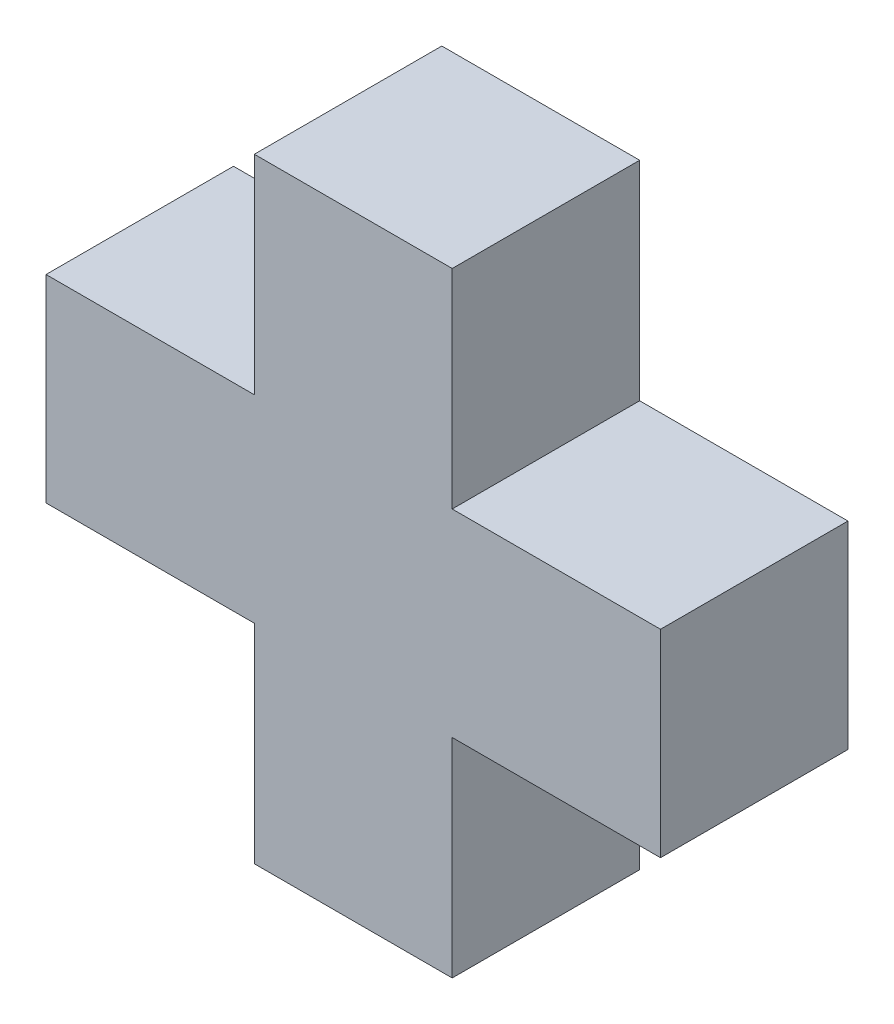
ISO-10303-21;
HEADER;
FILE_DESCRIPTION(('STEP AP214'),'2;1');
FILE_NAME('part.step','',(''),(''),'','','');
FILE_SCHEMA(('AUTOMOTIVE_DESIGN { 1 0 10303 214 1 1 1 1 }'));
ENDSEC;
DATA;
#1=APPLICATION_CONTEXT('core data for automotive mechanical design processes');
#2=APPLICATION_PROTOCOL_DEFINITION('international standard','automotive_design',2000,#1);
#3=PRODUCT_CONTEXT('',#1,'mechanical');
#4=PRODUCT('Part','Part','',(#3));
#5=PRODUCT_RELATED_PRODUCT_CATEGORY('part','',(#4));
#6=PRODUCT_DEFINITION_FORMATION('','',#4);
#7=PRODUCT_DEFINITION_CONTEXT('part definition',#1,'design');
#8=PRODUCT_DEFINITION('design','',#6,#7);
#9=PRODUCT_DEFINITION_SHAPE('','',#8);
#10=(LENGTH_UNIT() NAMED_UNIT(*) SI_UNIT(.MILLI.,.METRE.));
#11=(NAMED_UNIT(*) PLANE_ANGLE_UNIT() SI_UNIT($,.RADIAN.));
#12=(NAMED_UNIT(*) SI_UNIT($,.STERADIAN.) SOLID_ANGLE_UNIT());
#13=UNCERTAINTY_MEASURE_WITH_UNIT(LENGTH_MEASURE(1.E-05),#10,'distance_accuracy_value','');
#14=(GEOMETRIC_REPRESENTATION_CONTEXT(3) GLOBAL_UNCERTAINTY_ASSIGNED_CONTEXT((#13)) GLOBAL_UNIT_ASSIGNED_CONTEXT((#10,
#11,#12)) REPRESENTATION_CONTEXT('',''));
#15=CARTESIAN_POINT('',(0.,0.,0.));
#16=DIRECTION('',(0.,0.,1.));
#17=DIRECTION('',(1.,0.,0.));
#18=AXIS2_PLACEMENT_3D('',#15,#16,#17);
#19=CARTESIAN_POINT('',(4.75,4.75,9.));
#20=DIRECTION('',(-1.,0.,0.));
#21=DIRECTION('',(0.,-1.,0.));
#22=AXIS2_PLACEMENT_3D('',#19,#20,#21);
#23=PLANE('',#22);
#24=DIRECTION('',(0.,1.,0.));
#25=VECTOR('',#24,1.);
#26=CARTESIAN_POINT('',(4.75,4.75,0.));
#27=LINE('',#26,#25);
#28=CARTESIAN_POINT('',(4.75,4.75,0.));
#29=VERTEX_POINT('',#28);
#30=CARTESIAN_POINT('',(4.75,14.75,0.));
#31=VERTEX_POINT('',#30);
#32=EDGE_CURVE('E164',#29,#31,#27,.T.);
#33=ORIENTED_EDGE('',*,*,#32,.T.);
#34=DIRECTION('',(0.,0.,-1.));
#35=VECTOR('',#34,1.);
#36=CARTESIAN_POINT('',(4.75,14.75,9.));
#37=LINE('',#36,#35);
#38=CARTESIAN_POINT('',(4.75,14.75,9.));
#39=VERTEX_POINT('',#38);
#40=EDGE_CURVE('E11',#39,#31,#37,.T.);
#41=ORIENTED_EDGE('',*,*,#40,.F.);
#42=DIRECTION('',(0.,1.,0.));
#43=VECTOR('',#42,1.);
#44=CARTESIAN_POINT('',(4.75,4.75,9.));
#45=LINE('',#44,#43);
#46=CARTESIAN_POINT('',(4.75,4.75,9.));
#47=VERTEX_POINT('',#46);
#48=EDGE_CURVE('E198',#47,#39,#45,.T.);
#49=ORIENTED_EDGE('',*,*,#48,.F.);
#50=DIRECTION('',(0.,0.,-1.));
#51=VECTOR('',#50,1.);
#52=CARTESIAN_POINT('',(4.75,4.75,9.));
#53=LINE('',#52,#51);
#54=EDGE_CURVE('E160',#47,#29,#53,.T.);
#55=ORIENTED_EDGE('',*,*,#54,.T.);
#56=EDGE_LOOP('',(#33,#41,#49,#55));
#57=FACE_BOUND('',#56,.T.);
#58=ADVANCED_FACE('F39',(#57),#23,.F.);
#59=CARTESIAN_POINT('',(-4.75,14.75,9.));
#60=DIRECTION('',(0.,-1.,0.));
#61=DIRECTION('',(1.,0.,0.));
#62=AXIS2_PLACEMENT_3D('',#59,#60,#61);
#63=PLANE('',#62);
#64=DIRECTION('',(-1.,0.,0.));
#65=VECTOR('',#64,1.);
#66=CARTESIAN_POINT('',(-4.75,14.75,0.));
#67=LINE('',#66,#65);
#68=CARTESIAN_POINT('',(-4.75,14.75,0.));
#69=VERTEX_POINT('',#68);
#70=EDGE_CURVE('E168',#31,#69,#67,.T.);
#71=ORIENTED_EDGE('',*,*,#70,.T.);
#72=DIRECTION('',(0.,0.,-1.));
#73=VECTOR('',#72,1.);
#74=CARTESIAN_POINT('',(-4.75,14.75,9.));
#75=LINE('',#74,#73);
#76=CARTESIAN_POINT('',(-4.75,14.75,9.));
#77=VERTEX_POINT('',#76);
#78=EDGE_CURVE('E48',#77,#69,#75,.T.);
#79=ORIENTED_EDGE('',*,*,#78,.F.);
#80=DIRECTION('',(-1.,0.,0.));
#81=VECTOR('',#80,1.);
#82=CARTESIAN_POINT('',(-4.75,14.75,9.));
#83=LINE('',#82,#81);
#84=EDGE_CURVE('E111',#39,#77,#83,.T.);
#85=ORIENTED_EDGE('',*,*,#84,.F.);
#86=ORIENTED_EDGE('',*,*,#40,.T.);
#87=EDGE_LOOP('',(#71,#79,#85,#86));
#88=FACE_BOUND('',#87,.T.);
#89=ADVANCED_FACE('F292',(#88),#63,.F.);
#90=CARTESIAN_POINT('',(-4.75,4.75,9.));
#91=DIRECTION('',(1.,0.,0.));
#92=DIRECTION('',(0.,1.,0.));
#93=AXIS2_PLACEMENT_3D('',#90,#91,#92);
#94=PLANE('',#93);
#95=DIRECTION('',(0.,-1.,0.));
#96=VECTOR('',#95,1.);
#97=CARTESIAN_POINT('',(-4.75,4.75,0.));
#98=LINE('',#97,#96);
#99=CARTESIAN_POINT('',(-4.75,4.75,0.));
#100=VERTEX_POINT('',#99);
#101=EDGE_CURVE('E171',#69,#100,#98,.T.);
#102=ORIENTED_EDGE('',*,*,#101,.T.);
#103=DIRECTION('',(0.,0.,-1.));
#104=VECTOR('',#103,1.);
#105=CARTESIAN_POINT('',(-4.75,4.75,9.));
#106=LINE('',#105,#104);
#107=CARTESIAN_POINT('',(-4.75,4.75,9.));
#108=VERTEX_POINT('',#107);
#109=EDGE_CURVE('E225',#108,#100,#106,.T.);
#110=ORIENTED_EDGE('',*,*,#109,.F.);
#111=DIRECTION('',(0.,-1.,0.));
#112=VECTOR('',#111,1.);
#113=CARTESIAN_POINT('',(-4.75,4.75,9.));
#114=LINE('',#113,#112);
#115=EDGE_CURVE('E235',#77,#108,#114,.T.);
#116=ORIENTED_EDGE('',*,*,#115,.F.);
#117=ORIENTED_EDGE('',*,*,#78,.T.);
#118=EDGE_LOOP('',(#102,#110,#116,#117));
#119=FACE_BOUND('',#118,.T.);
#120=ADVANCED_FACE('F233',(#119),#94,.F.);
#121=CARTESIAN_POINT('',(-14.75,4.75,9.));
#122=DIRECTION('',(0.,-1.,0.));
#123=DIRECTION('',(1.,0.,0.));
#124=AXIS2_PLACEMENT_3D('',#121,#122,#123);
#125=PLANE('',#124);
#126=DIRECTION('',(-1.,0.,0.));
#127=VECTOR('',#126,1.);
#128=CARTESIAN_POINT('',(-14.75,4.75,0.));
#129=LINE('',#128,#127);
#130=CARTESIAN_POINT('',(-14.75,4.75,0.));
#131=VERTEX_POINT('',#130);
#132=EDGE_CURVE('E174',#100,#131,#129,.T.);
#133=ORIENTED_EDGE('',*,*,#132,.T.);
#134=DIRECTION('',(0.,0.,-1.));
#135=VECTOR('',#134,1.);
#136=CARTESIAN_POINT('',(-14.75,4.75,9.));
#137=LINE('',#136,#135);
#138=CARTESIAN_POINT('',(-14.75,4.75,9.));
#139=VERTEX_POINT('',#138);
#140=EDGE_CURVE('E221',#139,#131,#137,.T.);
#141=ORIENTED_EDGE('',*,*,#140,.F.);
#142=DIRECTION('',(-1.,0.,0.));
#143=VECTOR('',#142,1.);
#144=CARTESIAN_POINT('',(-14.75,4.75,9.));
#145=LINE('',#144,#143);
#146=EDGE_CURVE('E254',#108,#139,#145,.T.);
#147=ORIENTED_EDGE('',*,*,#146,.F.);
#148=ORIENTED_EDGE('',*,*,#109,.T.);
#149=EDGE_LOOP('',(#133,#141,#147,#148));
#150=FACE_BOUND('',#149,.T.);
#151=ADVANCED_FACE('F244',(#150),#125,.F.);
#152=CARTESIAN_POINT('',(-14.75,-4.75,9.));
#153=DIRECTION('',(1.,0.,0.));
#154=DIRECTION('',(0.,0.,-1.));
#155=AXIS2_PLACEMENT_3D('',#152,#153,#154);
#156=PLANE('',#155);
#157=DIRECTION('',(0.,-1.,0.));
#158=VECTOR('',#157,1.);
#159=CARTESIAN_POINT('',(-14.75,-4.75,0.));
#160=LINE('',#159,#158);
#161=CARTESIAN_POINT('',(-14.75,-4.75,0.));
#162=VERTEX_POINT('',#161);
#163=EDGE_CURVE('E177',#131,#162,#160,.T.);
#164=ORIENTED_EDGE('',*,*,#163,.T.);
#165=DIRECTION('',(0.,0.,-1.));
#166=VECTOR('',#165,1.);
#167=CARTESIAN_POINT('',(-14.75,-4.75,9.));
#168=LINE('',#167,#166);
#169=CARTESIAN_POINT('',(-14.75,-4.75,9.));
#170=VERTEX_POINT('',#169);
#171=EDGE_CURVE('E217',#170,#162,#168,.T.);
#172=ORIENTED_EDGE('',*,*,#171,.F.);
#173=DIRECTION('',(0.,-1.,0.));
#174=VECTOR('',#173,1.);
#175=CARTESIAN_POINT('',(-14.75,-4.75,9.));
#176=LINE('',#175,#174);
#177=EDGE_CURVE('E250',#139,#170,#176,.T.);
#178=ORIENTED_EDGE('',*,*,#177,.F.);
#179=ORIENTED_EDGE('',*,*,#140,.T.);
#180=EDGE_LOOP('',(#164,#172,#178,#179));
#181=FACE_BOUND('',#180,.T.);
#182=ADVANCED_FACE('F248',(#181),#156,.F.);
#183=CARTESIAN_POINT('',(-14.75,-4.75,9.));
#184=DIRECTION('',(0.,1.,0.));
#185=DIRECTION('',(-1.,0.,0.));
#186=AXIS2_PLACEMENT_3D('',#183,#184,#185);
#187=PLANE('',#186);
#188=DIRECTION('',(1.,0.,0.));
#189=VECTOR('',#188,1.);
#190=CARTESIAN_POINT('',(-14.75,-4.75,0.));
#191=LINE('',#190,#189);
#192=CARTESIAN_POINT('',(-4.75,-4.75,0.));
#193=VERTEX_POINT('',#192);
#194=EDGE_CURVE('E180',#162,#193,#191,.T.);
#195=ORIENTED_EDGE('',*,*,#194,.T.);
#196=DIRECTION('',(0.,0.,-1.));
#197=VECTOR('',#196,1.);
#198=CARTESIAN_POINT('',(-4.75,-4.75,9.));
#199=LINE('',#198,#197);
#200=CARTESIAN_POINT('',(-4.75,-4.75,9.));
#201=VERTEX_POINT('',#200);
#202=EDGE_CURVE('E213',#201,#193,#199,.T.);
#203=ORIENTED_EDGE('',*,*,#202,.F.);
#204=DIRECTION('',(1.,0.,0.));
#205=VECTOR('',#204,1.);
#206=CARTESIAN_POINT('',(-14.75,-4.75,9.));
#207=LINE('',#206,#205);
#208=EDGE_CURVE('E253',#170,#201,#207,.T.);
#209=ORIENTED_EDGE('',*,*,#208,.F.);
#210=ORIENTED_EDGE('',*,*,#171,.T.);
#211=EDGE_LOOP('',(#195,#203,#209,#210));
#212=FACE_BOUND('',#211,.T.);
#213=ADVANCED_FACE('F305',(#212),#187,.F.);
#214=CARTESIAN_POINT('',(-4.75,-14.75,9.));
#215=DIRECTION('',(1.,0.,0.));
#216=DIRECTION('',(0.,1.,0.));
#217=AXIS2_PLACEMENT_3D('',#214,#215,#216);
#218=PLANE('',#217);
#219=DIRECTION('',(0.,-1.,0.));
#220=VECTOR('',#219,1.);
#221=CARTESIAN_POINT('',(-4.75,-14.75,0.));
#222=LINE('',#221,#220);
#223=CARTESIAN_POINT('',(-4.75,-14.75,0.));
#224=VERTEX_POINT('',#223);
#225=EDGE_CURVE('E183',#193,#224,#222,.T.);
#226=ORIENTED_EDGE('',*,*,#225,.T.);
#227=DIRECTION('',(0.,0.,-1.));
#228=VECTOR('',#227,1.);
#229=CARTESIAN_POINT('',(-4.75,-14.75,9.));
#230=LINE('',#229,#228);
#231=CARTESIAN_POINT('',(-4.75,-14.75,9.));
#232=VERTEX_POINT('',#231);
#233=EDGE_CURVE('E209',#232,#224,#230,.T.);
#234=ORIENTED_EDGE('',*,*,#233,.F.);
#235=DIRECTION('',(0.,-1.,0.));
#236=VECTOR('',#235,1.);
#237=CARTESIAN_POINT('',(-4.75,-14.75,9.));
#238=LINE('',#237,#236);
#239=EDGE_CURVE('E258',#201,#232,#238,.T.);
#240=ORIENTED_EDGE('',*,*,#239,.F.);
#241=ORIENTED_EDGE('',*,*,#202,.T.);
#242=EDGE_LOOP('',(#226,#234,#240,#241));
#243=FACE_BOUND('',#242,.T.);
#244=ADVANCED_FACE('F308',(#243),#218,.F.);
#245=CARTESIAN_POINT('',(-4.75,-14.75,9.));
#246=DIRECTION('',(0.,1.,0.));
#247=DIRECTION('',(-1.,0.,0.));
#248=AXIS2_PLACEMENT_3D('',#245,#246,#247);
#249=PLANE('',#248);
#250=DIRECTION('',(1.,0.,0.));
#251=VECTOR('',#250,1.);
#252=CARTESIAN_POINT('',(-4.75,-14.75,0.));
#253=LINE('',#252,#251);
#254=CARTESIAN_POINT('',(4.75,-14.75,0.));
#255=VERTEX_POINT('',#254);
#256=EDGE_CURVE('E186',#224,#255,#253,.T.);
#257=ORIENTED_EDGE('',*,*,#256,.T.);
#258=DIRECTION('',(0.,0.,-1.));
#259=VECTOR('',#258,1.);
#260=CARTESIAN_POINT('',(4.75,-14.75,9.));
#261=LINE('',#260,#259);
#262=CARTESIAN_POINT('',(4.75,-14.75,9.));
#263=VERTEX_POINT('',#262);
#264=EDGE_CURVE('E205',#263,#255,#261,.T.);
#265=ORIENTED_EDGE('',*,*,#264,.F.);
#266=DIRECTION('',(1.,0.,0.));
#267=VECTOR('',#266,1.);
#268=CARTESIAN_POINT('',(-4.75,-14.75,9.));
#269=LINE('',#268,#267);
#270=EDGE_CURVE('E265',#232,#263,#269,.T.);
#271=ORIENTED_EDGE('',*,*,#270,.F.);
#272=ORIENTED_EDGE('',*,*,#233,.T.);
#273=EDGE_LOOP('',(#257,#265,#271,#272));
#274=FACE_BOUND('',#273,.T.);
#275=ADVANCED_FACE('F273',(#274),#249,.F.);
#276=CARTESIAN_POINT('',(4.75,-14.75,9.));
#277=DIRECTION('',(-1.,0.,0.));
#278=DIRECTION('',(0.,-1.,0.));
#279=AXIS2_PLACEMENT_3D('',#276,#277,#278);
#280=PLANE('',#279);
#281=DIRECTION('',(0.,1.,0.));
#282=VECTOR('',#281,1.);
#283=CARTESIAN_POINT('',(4.75,-14.75,0.));
#284=LINE('',#283,#282);
#285=CARTESIAN_POINT('',(4.75,-4.75,0.));
#286=VERTEX_POINT('',#285);
#287=EDGE_CURVE('E189',#255,#286,#284,.T.);
#288=ORIENTED_EDGE('',*,*,#287,.T.);
#289=DIRECTION('',(0.,0.,-1.));
#290=VECTOR('',#289,1.);
#291=CARTESIAN_POINT('',(4.75,-4.75,9.));
#292=LINE('',#291,#290);
#293=CARTESIAN_POINT('',(4.75,-4.75,9.));
#294=VERTEX_POINT('',#293);
#295=EDGE_CURVE('E153',#294,#286,#292,.T.);
#296=ORIENTED_EDGE('',*,*,#295,.F.);
#297=DIRECTION('',(0.,1.,0.));
#298=VECTOR('',#297,1.);
#299=CARTESIAN_POINT('',(4.75,-14.75,9.));
#300=LINE('',#299,#298);
#301=EDGE_CURVE('E142',#263,#294,#300,.T.);
#302=ORIENTED_EDGE('',*,*,#301,.F.);
#303=ORIENTED_EDGE('',*,*,#264,.T.);
#304=EDGE_LOOP('',(#288,#296,#302,#303));
#305=FACE_BOUND('',#304,.T.);
#306=ADVANCED_FACE('F277',(#305),#280,.F.);
#307=CARTESIAN_POINT('',(4.75,-4.75,9.));
#308=DIRECTION('',(0.,1.,0.));
#309=DIRECTION('',(0.,0.,1.));
#310=AXIS2_PLACEMENT_3D('',#307,#308,#309);
#311=PLANE('',#310);
#312=DIRECTION('',(1.,0.,0.));
#313=VECTOR('',#312,1.);
#314=CARTESIAN_POINT('',(4.75,-4.75,0.));
#315=LINE('',#314,#313);
#316=CARTESIAN_POINT('',(14.75,-4.75,0.));
#317=VERTEX_POINT('',#316);
#318=EDGE_CURVE('E151',#286,#317,#315,.T.);
#319=ORIENTED_EDGE('',*,*,#318,.T.);
#320=DIRECTION('',(0.,0.,-1.));
#321=VECTOR('',#320,1.);
#322=CARTESIAN_POINT('',(14.75,-4.75,9.));
#323=LINE('',#322,#321);
#324=CARTESIAN_POINT('',(14.75,-4.75,9.));
#325=VERTEX_POINT('',#324);
#326=EDGE_CURVE('E148',#325,#317,#323,.T.);
#327=ORIENTED_EDGE('',*,*,#326,.F.);
#328=DIRECTION('',(1.,0.,0.));
#329=VECTOR('',#328,1.);
#330=CARTESIAN_POINT('',(4.75,-4.75,9.));
#331=LINE('',#330,#329);
#332=EDGE_CURVE('E136',#294,#325,#331,.T.);
#333=ORIENTED_EDGE('',*,*,#332,.F.);
#334=ORIENTED_EDGE('',*,*,#295,.T.);
#335=EDGE_LOOP('',(#319,#327,#333,#334));
#336=FACE_BOUND('',#335,.T.);
#337=ADVANCED_FACE('F149',(#336),#311,.F.);
#338=CARTESIAN_POINT('',(14.75,-4.75,9.));
#339=DIRECTION('',(-1.,0.,0.));
#340=DIRECTION('',(0.,0.,1.));
#341=AXIS2_PLACEMENT_3D('',#338,#339,#340);
#342=PLANE('',#341);
#343=DIRECTION('',(0.,1.,0.));
#344=VECTOR('',#343,1.);
#345=CARTESIAN_POINT('',(14.75,-4.75,0.));
#346=LINE('',#345,#344);
#347=CARTESIAN_POINT('',(14.75,4.75,0.));
#348=VERTEX_POINT('',#347);
#349=EDGE_CURVE('E97',#317,#348,#346,.T.);
#350=ORIENTED_EDGE('',*,*,#349,.T.);
#351=DIRECTION('',(0.,0.,-1.));
#352=VECTOR('',#351,1.);
#353=CARTESIAN_POINT('',(14.75,4.75,9.));
#354=LINE('',#353,#352);
#355=CARTESIAN_POINT('',(14.75,4.75,9.));
#356=VERTEX_POINT('',#355);
#357=EDGE_CURVE('E154',#356,#348,#354,.T.);
#358=ORIENTED_EDGE('',*,*,#357,.F.);
#359=DIRECTION('',(0.,1.,0.));
#360=VECTOR('',#359,1.);
#361=CARTESIAN_POINT('',(14.75,-4.75,9.));
#362=LINE('',#361,#360);
#363=EDGE_CURVE('E140',#325,#356,#362,.T.);
#364=ORIENTED_EDGE('',*,*,#363,.F.);
#365=ORIENTED_EDGE('',*,*,#326,.T.);
#366=EDGE_LOOP('',(#350,#358,#364,#365));
#367=FACE_BOUND('',#366,.T.);
#368=ADVANCED_FACE('F156',(#367),#342,.F.);
#369=CARTESIAN_POINT('',(4.75,4.75,9.));
#370=DIRECTION('',(0.,-1.,0.));
#371=DIRECTION('',(1.,0.,0.));
#372=AXIS2_PLACEMENT_3D('',#369,#370,#371);
#373=PLANE('',#372);
#374=DIRECTION('',(-1.,0.,0.));
#375=VECTOR('',#374,1.);
#376=CARTESIAN_POINT('',(4.75,4.75,0.));
#377=LINE('',#376,#375);
#378=EDGE_CURVE('E103',#348,#29,#377,.T.);
#379=ORIENTED_EDGE('',*,*,#378,.T.);
#380=ORIENTED_EDGE('',*,*,#54,.F.);
#381=DIRECTION('',(-1.,0.,0.));
#382=VECTOR('',#381,1.);
#383=CARTESIAN_POINT('',(4.75,4.75,9.));
#384=LINE('',#383,#382);
#385=EDGE_CURVE('E56',#356,#47,#384,.T.);
#386=ORIENTED_EDGE('',*,*,#385,.F.);
#387=ORIENTED_EDGE('',*,*,#357,.T.);
#388=EDGE_LOOP('',(#379,#380,#386,#387));
#389=FACE_BOUND('',#388,.T.);
#390=ADVANCED_FACE('F281',(#389),#373,.F.);
#391=CARTESIAN_POINT('',(0.,0.,9.));
#392=DIRECTION('',(0.,0.,-1.));
#393=DIRECTION('',(-1.,0.,0.));
#394=AXIS2_PLACEMENT_3D('',#391,#392,#393);
#395=PLANE('',#394);
#396=ORIENTED_EDGE('',*,*,#48,.T.);
#397=ORIENTED_EDGE('',*,*,#84,.T.);
#398=ORIENTED_EDGE('',*,*,#115,.T.);
#399=ORIENTED_EDGE('',*,*,#146,.T.);
#400=ORIENTED_EDGE('',*,*,#177,.T.);
#401=ORIENTED_EDGE('',*,*,#208,.T.);
#402=ORIENTED_EDGE('',*,*,#239,.T.);
#403=ORIENTED_EDGE('',*,*,#270,.T.);
#404=ORIENTED_EDGE('',*,*,#301,.T.);
#405=ORIENTED_EDGE('',*,*,#332,.T.);
#406=ORIENTED_EDGE('',*,*,#363,.T.);
#407=ORIENTED_EDGE('',*,*,#385,.T.);
#408=EDGE_LOOP('',(#396,#397,#398,#399,#400,#401,#402,#403,#404,#405,#406,#407));
#409=FACE_BOUND('',#408,.T.);
#410=ADVANCED_FACE('F138',(#409),#395,.F.);
#411=CARTESIAN_POINT('',(0.,0.,0.));
#412=DIRECTION('',(0.,0.,-1.));
#413=DIRECTION('',(-1.,0.,0.));
#414=AXIS2_PLACEMENT_3D('',#411,#412,#413);
#415=PLANE('',#414);
#416=ORIENTED_EDGE('',*,*,#32,.F.);
#417=ORIENTED_EDGE('',*,*,#378,.F.);
#418=ORIENTED_EDGE('',*,*,#349,.F.);
#419=ORIENTED_EDGE('',*,*,#318,.F.);
#420=ORIENTED_EDGE('',*,*,#287,.F.);
#421=ORIENTED_EDGE('',*,*,#256,.F.);
#422=ORIENTED_EDGE('',*,*,#225,.F.);
#423=ORIENTED_EDGE('',*,*,#194,.F.);
#424=ORIENTED_EDGE('',*,*,#163,.F.);
#425=ORIENTED_EDGE('',*,*,#132,.F.);
#426=ORIENTED_EDGE('',*,*,#101,.F.);
#427=ORIENTED_EDGE('',*,*,#70,.F.);
#428=EDGE_LOOP('',(#416,#417,#418,#419,#420,#421,#422,#423,#424,#425,#426,#427));
#429=FACE_BOUND('',#428,.T.);
#430=ADVANCED_FACE('F239',(#429),#415,.T.);
#431=CLOSED_SHELL('',(#58,#89,#120,#151,#182,#213,#244,#275,#306,#337,#368,#390,#410,#430));
#432=MANIFOLD_SOLID_BREP('B2',#431);
#433=ADVANCED_BREP_SHAPE_REPRESENTATION('',(#18,#432),#14);
#434=SHAPE_DEFINITION_REPRESENTATION(#9,#433);
ENDSEC;
END-ISO-10303-21;
